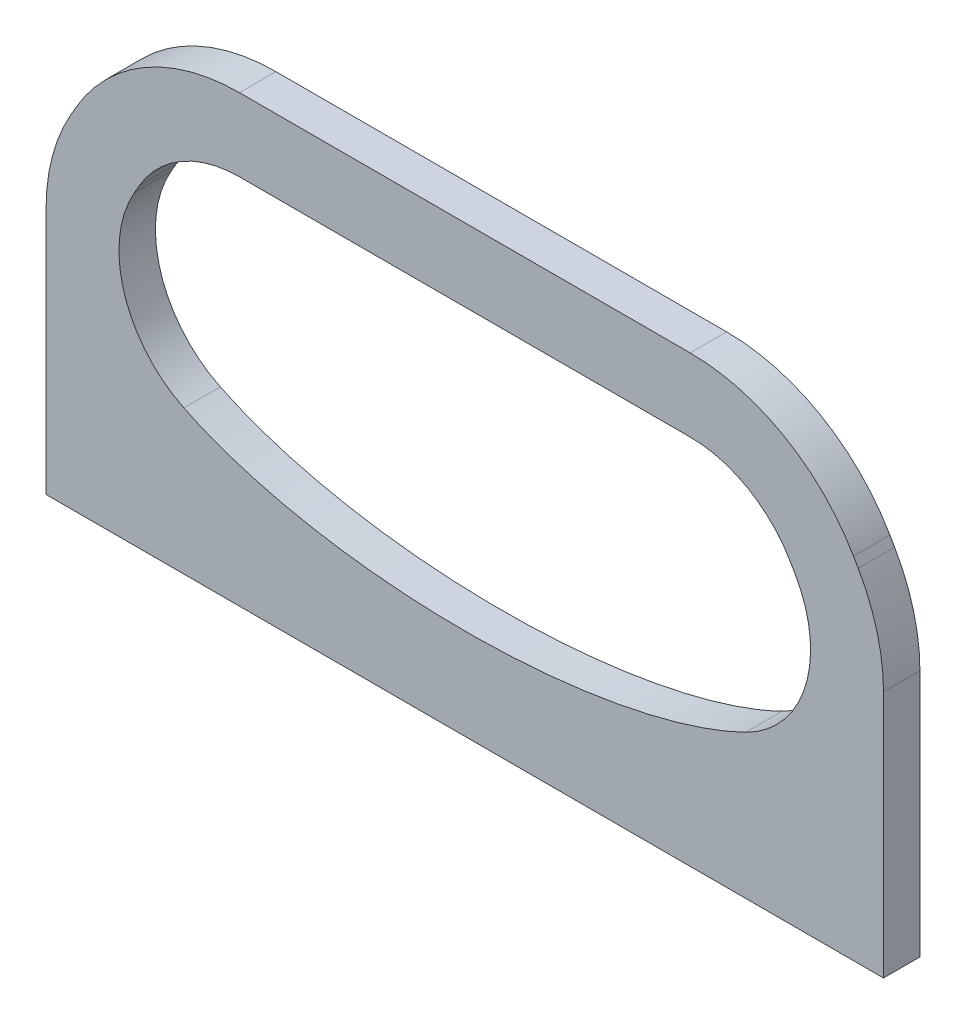
ISO-10303-21;
HEADER;
FILE_DESCRIPTION(('STEP AP214'),'2;1');
FILE_NAME('part.step','',(''),(''),'','','');
FILE_SCHEMA(('AUTOMOTIVE_DESIGN { 1 0 10303 214 1 1 1 1 }'));
ENDSEC;
DATA;
#1=APPLICATION_CONTEXT('core data for automotive mechanical design processes');
#2=APPLICATION_PROTOCOL_DEFINITION('international standard','automotive_design',2000,#1);
#3=PRODUCT_CONTEXT('',#1,'mechanical');
#4=PRODUCT('Part','Part','',(#3));
#5=PRODUCT_RELATED_PRODUCT_CATEGORY('part','',(#4));
#6=PRODUCT_DEFINITION_FORMATION('','',#4);
#7=PRODUCT_DEFINITION_CONTEXT('part definition',#1,'design');
#8=PRODUCT_DEFINITION('design','',#6,#7);
#9=PRODUCT_DEFINITION_SHAPE('','',#8);
#10=(LENGTH_UNIT() NAMED_UNIT(*) SI_UNIT(.MILLI.,.METRE.));
#11=(NAMED_UNIT(*) PLANE_ANGLE_UNIT() SI_UNIT($,.RADIAN.));
#12=(NAMED_UNIT(*) SI_UNIT($,.STERADIAN.) SOLID_ANGLE_UNIT());
#13=UNCERTAINTY_MEASURE_WITH_UNIT(LENGTH_MEASURE(1.E-05),#10,'distance_accuracy_value','');
#14=(GEOMETRIC_REPRESENTATION_CONTEXT(3) GLOBAL_UNCERTAINTY_ASSIGNED_CONTEXT((#13)) GLOBAL_UNIT_ASSIGNED_CONTEXT((#10,
#11,#12)) REPRESENTATION_CONTEXT('',''));
#15=CARTESIAN_POINT('',(0.,0.,0.));
#16=DIRECTION('',(0.,0.,1.));
#17=DIRECTION('',(1.,0.,0.));
#18=AXIS2_PLACEMENT_3D('',#15,#16,#17);
#19=CARTESIAN_POINT('',(0.,11.7,0.));
#20=DIRECTION('',(0.,1.,0.));
#21=DIRECTION('',(0.,0.,1.));
#22=AXIS2_PLACEMENT_3D('',#19,#20,#21);
#23=PLANE('',#22);
#24=DIRECTION('',(1.,0.,0.));
#25=VECTOR('',#24,1.);
#26=CARTESIAN_POINT('',(0.,11.7,-22.98));
#27=LINE('',#26,#25);
#28=CARTESIAN_POINT('',(-23.3818920339161,11.7,-22.98));
#29=VERTEX_POINT('',#28);
#30=CARTESIAN_POINT('',(-11.0181079660839,11.7,-22.98));
#31=VERTEX_POINT('',#30);
#32=EDGE_CURVE('E313',#29,#31,#27,.T.);
#33=ORIENTED_EDGE('',*,*,#32,.F.);
#34=DIRECTION('',(0.,0.,-1.));
#35=VECTOR('',#34,1.);
#36=CARTESIAN_POINT('',(-23.3818920339161,11.7,-21.98));
#37=LINE('',#36,#35);
#38=CARTESIAN_POINT('',(-23.3818920339161,11.7,-21.98));
#39=VERTEX_POINT('',#38);
#40=EDGE_CURVE('E209',#39,#29,#37,.T.);
#41=ORIENTED_EDGE('',*,*,#40,.F.);
#42=DIRECTION('',(-1.,0.,0.));
#43=VECTOR('',#42,1.);
#44=CARTESIAN_POINT('',(0.,11.7,-21.98));
#45=LINE('',#44,#43);
#46=CARTESIAN_POINT('',(-11.0181079660839,11.7,-21.98));
#47=VERTEX_POINT('',#46);
#48=EDGE_CURVE('E342',#47,#39,#45,.T.);
#49=ORIENTED_EDGE('',*,*,#48,.F.);
#50=DIRECTION('',(0.,0.,-1.));
#51=VECTOR('',#50,1.);
#52=CARTESIAN_POINT('',(-11.0181079660839,11.7,-21.98));
#53=LINE('',#52,#51);
#54=EDGE_CURVE('E206',#47,#31,#53,.T.);
#55=ORIENTED_EDGE('',*,*,#54,.T.);
#56=EDGE_LOOP('',(#33,#41,#49,#55));
#57=FACE_BOUND('',#56,.T.);
#58=ADVANCED_FACE('F58',(#57),#23,.T.);
#59=CARTESIAN_POINT('',(-17.2,5.85,-13.5));
#60=DIRECTION('',(0.,0.,1.));
#61=DIRECTION('',(1.,0.,0.));
#62=AXIS2_PLACEMENT_3D('',#59,#60,#61);
#63=ELLIPSE('',#62,9.8625,3.85);
#64=DIRECTION('',(0.,0.,-1.));
#65=VECTOR('',#64,1.);
#66=SURFACE_OF_LINEAR_EXTRUSION('',#63,#65);
#67=CARTESIAN_POINT('',(-17.2,5.85,-22.98));
#68=DIRECTION('',(0.,0.,1.));
#69=DIRECTION('',(1.,0.,0.));
#70=AXIS2_PLACEMENT_3D('',#67,#68,#69);
#71=ELLIPSE('',#70,9.8625,3.85);
#72=CARTESIAN_POINT('',(-24.9060416712449,3.44723053060076,-22.98));
#73=VERTEX_POINT('',#72);
#74=CARTESIAN_POINT('',(-9.49395832875332,3.44723053060165,-22.98));
#75=VERTEX_POINT('',#74);
#76=EDGE_CURVE('E331',#73,#75,#71,.T.);
#77=ORIENTED_EDGE('',*,*,#76,.F.);
#78=DIRECTION('',(0.,0.,-1.));
#79=VECTOR('',#78,1.);
#80=CARTESIAN_POINT('',(-24.9060416712437,3.4472305306002,-27.3373437472684));
#81=LINE('',#80,#79);
#82=CARTESIAN_POINT('',(-24.9060416712458,3.4472305306012,-21.98));
#83=VERTEX_POINT('',#82);
#84=EDGE_CURVE('E85',#73,#83,#81,.F.);
#85=ORIENTED_EDGE('',*,*,#84,.T.);
#86=CARTESIAN_POINT('',(-17.2,5.85,-21.98));
#87=DIRECTION('',(0.,0.,-1.));
#88=DIRECTION('',(1.,0.,0.));
#89=AXIS2_PLACEMENT_3D('',#86,#87,#88);
#90=ELLIPSE('',#89,9.8625,3.85);
#91=CARTESIAN_POINT('',(-9.49395832875422,3.44723053060121,-21.98));
#92=VERTEX_POINT('',#91);
#93=EDGE_CURVE('E182',#92,#83,#90,.T.);
#94=ORIENTED_EDGE('',*,*,#93,.F.);
#95=DIRECTION('',(0.,0.,-1.));
#96=VECTOR('',#95,1.);
#97=CARTESIAN_POINT('',(-9.49395832875629,3.4472305306002,-17.6626562527314));
#98=LINE('',#97,#96);
#99=EDGE_CURVE('E181',#92,#75,#98,.T.);
#100=ORIENTED_EDGE('',*,*,#99,.T.);
#101=EDGE_LOOP('',(#77,#85,#94,#100));
#102=FACE_BOUND('',#101,.T.);
#103=ADVANCED_FACE('F60',(#102),#66,.T.);
#104=CARTESIAN_POINT('',(-23.8875,9.7,-13.5));
#105=DIRECTION('',(0.,-1.,0.));
#106=DIRECTION('',(0.,0.,-1.));
#107=AXIS2_PLACEMENT_3D('',#104,#105,#106);
#108=PLANE('',#107);
#109=DIRECTION('',(-1.,0.,0.));
#110=VECTOR('',#109,1.);
#111=CARTESIAN_POINT('',(-23.8875,9.7,-22.98));
#112=LINE('',#111,#110);
#113=CARTESIAN_POINT('',(-11.0181079660839,9.7,-22.98));
#114=VERTEX_POINT('',#113);
#115=CARTESIAN_POINT('',(-23.3818920339161,9.7,-22.98));
#116=VERTEX_POINT('',#115);
#117=EDGE_CURVE('E315',#114,#116,#112,.T.);
#118=ORIENTED_EDGE('',*,*,#117,.F.);
#119=DIRECTION('',(0.,0.,-1.));
#120=VECTOR('',#119,1.);
#121=CARTESIAN_POINT('',(-11.0181079660839,9.7,-13.5));
#122=LINE('',#121,#120);
#123=CARTESIAN_POINT('',(-11.0181079660839,9.7,-21.98));
#124=VERTEX_POINT('',#123);
#125=EDGE_CURVE('E167',#114,#124,#122,.F.);
#126=ORIENTED_EDGE('',*,*,#125,.T.);
#127=DIRECTION('',(1.,0.,0.));
#128=VECTOR('',#127,1.);
#129=CARTESIAN_POINT('',(0.,9.7,-21.98));
#130=LINE('',#129,#128);
#131=CARTESIAN_POINT('',(-23.3818920339161,9.7,-21.98));
#132=VERTEX_POINT('',#131);
#133=EDGE_CURVE('E302',#132,#124,#130,.T.);
#134=ORIENTED_EDGE('',*,*,#133,.F.);
#135=DIRECTION('',(0.,0.,1.));
#136=VECTOR('',#135,1.);
#137=CARTESIAN_POINT('',(-23.3818920339161,9.7,-13.5));
#138=LINE('',#137,#136);
#139=EDGE_CURVE('E234',#132,#116,#138,.F.);
#140=ORIENTED_EDGE('',*,*,#139,.T.);
#141=EDGE_LOOP('',(#118,#126,#134,#140));
#142=FACE_BOUND('',#141,.T.);
#143=ADVANCED_FACE('F353',(#142),#108,.T.);
#144=CARTESIAN_POINT('',(-7.3375,6.5,-13.5));
#145=DIRECTION('',(-0.866025403784437,-0.500000000000003,0.));
#146=DIRECTION('',(0.,0.,1.));
#147=AXIS2_PLACEMENT_3D('',#144,#145,#146);
#148=PLANE('',#147);
#149=DIRECTION('',(0.,0.,1.));
#150=VECTOR('',#149,1.);
#151=CARTESIAN_POINT('',(-8.26847730906828,8.11250000000001,-13.5));
#152=LINE('',#151,#150);
#153=CARTESIAN_POINT('',(-8.26847730906891,8.1125000000011,-21.98));
#154=VERTEX_POINT('',#153);
#155=CARTESIAN_POINT('',(-8.26847730906828,8.11250000000001,-22.98));
#156=VERTEX_POINT('',#155);
#157=EDGE_CURVE('E166',#154,#156,#152,.F.);
#158=ORIENTED_EDGE('',*,*,#157,.T.);
#159=DIRECTION('',(-0.500000000000003,0.866025403784437,0.));
#160=VECTOR('',#159,1.);
#161=CARTESIAN_POINT('',(-7.3375,6.5,-22.98));
#162=LINE('',#161,#160);
#163=CARTESIAN_POINT('',(-8.13844800231135,7.88728263422404,-22.98));
#164=VERTEX_POINT('',#163);
#165=EDGE_CURVE('E76',#156,#164,#162,.F.);
#166=ORIENTED_EDGE('',*,*,#165,.T.);
#167=DIRECTION('',(0.,0.,1.));
#168=VECTOR('',#167,1.);
#169=CARTESIAN_POINT('',(-8.13844800231141,7.88728263422415,-13.5));
#170=LINE('',#169,#168);
#171=CARTESIAN_POINT('',(-8.13844800231134,7.88728263422404,-21.98));
#172=VERTEX_POINT('',#171);
#173=EDGE_CURVE('E157',#164,#172,#170,.T.);
#174=ORIENTED_EDGE('',*,*,#173,.T.);
#175=DIRECTION('',(0.500000000000003,-0.866025403784437,0.));
#176=VECTOR('',#175,1.);
#177=CARTESIAN_POINT('',(-2.68854243770054,-1.55223070013415,-21.98));
#178=LINE('',#177,#176);
#179=EDGE_CURVE('E161',#154,#172,#178,.T.);
#180=ORIENTED_EDGE('',*,*,#179,.F.);
#181=EDGE_LOOP('',(#158,#166,#174,#180));
#182=FACE_BOUND('',#181,.T.);
#183=ADVANCED_FACE('F160',(#182),#148,.T.);
#184=CARTESIAN_POINT('',(-25.2149791385932,9.7,-13.5));
#185=DIRECTION('',(0.866025403784437,-0.500000000000003,0.));
#186=DIRECTION('',(0.,0.,1.));
#187=AXIS2_PLACEMENT_3D('',#184,#185,#186);
#188=PLANE('',#187);
#189=DIRECTION('',(0.,0.,1.));
#190=VECTOR('',#189,1.);
#191=CARTESIAN_POINT('',(-26.2615519976886,7.88728263422415,-13.5));
#192=LINE('',#191,#190);
#193=CARTESIAN_POINT('',(-26.2615519976886,7.88728263422404,-21.98));
#194=VERTEX_POINT('',#193);
#195=CARTESIAN_POINT('',(-26.2615519976886,7.88728263422404,-22.98));
#196=VERTEX_POINT('',#195);
#197=EDGE_CURVE('E68',#194,#196,#192,.F.);
#198=ORIENTED_EDGE('',*,*,#197,.T.);
#199=DIRECTION('',(-0.500000000000003,-0.866025403784437,0.));
#200=VECTOR('',#199,1.);
#201=CARTESIAN_POINT('',(-25.2149791385932,9.7,-22.98));
#202=LINE('',#201,#200);
#203=CARTESIAN_POINT('',(-26.1315226909317,8.11250000000001,-22.98));
#204=VERTEX_POINT('',#203);
#205=EDGE_CURVE('E328',#196,#204,#202,.F.);
#206=ORIENTED_EDGE('',*,*,#205,.T.);
#207=DIRECTION('',(0.,0.,-1.));
#208=VECTOR('',#207,1.);
#209=CARTESIAN_POINT('',(-26.1315226909317,8.11250000000001,-13.5));
#210=LINE('',#209,#208);
#211=CARTESIAN_POINT('',(-26.1315226909317,8.11250000000001,-21.98));
#212=VERTEX_POINT('',#211);
#213=EDGE_CURVE('E239',#204,#212,#210,.F.);
#214=ORIENTED_EDGE('',*,*,#213,.T.);
#215=DIRECTION('',(0.500000000000003,0.866025403784437,0.));
#216=VECTOR('',#215,1.);
#217=CARTESIAN_POINT('',(-23.1114575622994,13.3434062449582,-21.98));
#218=LINE('',#217,#216);
#219=EDGE_CURVE('E296',#194,#212,#218,.T.);
#220=ORIENTED_EDGE('',*,*,#219,.F.);
#221=EDGE_LOOP('',(#198,#206,#214,#220));
#222=FACE_BOUND('',#221,.T.);
#223=ADVANCED_FACE('F366',(#222),#188,.T.);
#224=CARTESIAN_POINT('',(-10.888078659327,6.29978263422415,-22.5000000000001));
#225=DIRECTION('',(0.,0.,-1.));
#226=DIRECTION('',(-1.,0.,0.));
#227=AXIS2_PLACEMENT_3D('',#224,#225,#226);
#228=CYLINDRICAL_SURFACE('',#227,3.175);
#229=ORIENTED_EDGE('',*,*,#173,.F.);
#230=CARTESIAN_POINT('',(-10.888078659327,6.29978263422415,-22.98));
#231=DIRECTION('',(0.,0.,1.));
#232=DIRECTION('',(1.,0.,0.));
#233=AXIS2_PLACEMENT_3D('',#230,#231,#232);
#234=CIRCLE('',#233,3.175);
#235=EDGE_CURVE('E326',#164,#75,#234,.F.);
#236=ORIENTED_EDGE('',*,*,#235,.T.);
#237=ORIENTED_EDGE('',*,*,#99,.F.);
#238=CARTESIAN_POINT('',(-10.888078659327,6.29978263422415,-21.98));
#239=DIRECTION('',(0.,0.,1.));
#240=DIRECTION('',(1.,0.,0.));
#241=AXIS2_PLACEMENT_3D('',#238,#239,#240);
#242=CIRCLE('',#241,3.175);
#243=EDGE_CURVE('E174',#172,#92,#242,.F.);
#244=ORIENTED_EDGE('',*,*,#243,.F.);
#245=EDGE_LOOP('',(#229,#236,#237,#244));
#246=FACE_BOUND('',#245,.T.);
#247=ADVANCED_FACE('F179',(#246),#228,.F.);
#248=CARTESIAN_POINT('',(-23.511921340673,6.29978263422414,-22.5));
#249=DIRECTION('',(0.,0.,-1.));
#250=DIRECTION('',(-1.,0.,0.));
#251=AXIS2_PLACEMENT_3D('',#248,#249,#250);
#252=CYLINDRICAL_SURFACE('',#251,3.175);
#253=ORIENTED_EDGE('',*,*,#84,.F.);
#254=CARTESIAN_POINT('',(-23.511921340673,6.29978263422414,-22.98));
#255=DIRECTION('',(0.,0.,1.));
#256=DIRECTION('',(1.,0.,0.));
#257=AXIS2_PLACEMENT_3D('',#254,#255,#256);
#258=CIRCLE('',#257,3.175);
#259=EDGE_CURVE('E192',#73,#196,#258,.F.);
#260=ORIENTED_EDGE('',*,*,#259,.T.);
#261=ORIENTED_EDGE('',*,*,#197,.F.);
#262=CARTESIAN_POINT('',(-23.511921340673,6.29978263422414,-21.98));
#263=DIRECTION('',(0.,0.,1.));
#264=DIRECTION('',(1.,0.,0.));
#265=AXIS2_PLACEMENT_3D('',#262,#263,#264);
#266=CIRCLE('',#265,3.175);
#267=EDGE_CURVE('E294',#83,#194,#266,.F.);
#268=ORIENTED_EDGE('',*,*,#267,.F.);
#269=EDGE_LOOP('',(#253,#260,#261,#268));
#270=FACE_BOUND('',#269,.T.);
#271=ADVANCED_FACE('F361',(#270),#252,.F.);
#272=CARTESIAN_POINT('',(-23.3818920339161,6.525,-13.5));
#273=DIRECTION('',(0.,0.,1.));
#274=DIRECTION('',(1.,0.,0.));
#275=AXIS2_PLACEMENT_3D('',#272,#273,#274);
#276=CYLINDRICAL_SURFACE('',#275,3.175);
#277=ORIENTED_EDGE('',*,*,#213,.F.);
#278=CARTESIAN_POINT('',(-23.3818920339161,6.525,-22.98));
#279=DIRECTION('',(0.,0.,1.));
#280=DIRECTION('',(1.,0.,0.));
#281=AXIS2_PLACEMENT_3D('',#278,#279,#280);
#282=CIRCLE('',#281,3.175);
#283=EDGE_CURVE('E323',#204,#116,#282,.F.);
#284=ORIENTED_EDGE('',*,*,#283,.T.);
#285=ORIENTED_EDGE('',*,*,#139,.F.);
#286=CARTESIAN_POINT('',(-23.3818920339161,6.525,-21.98));
#287=DIRECTION('',(0.,0.,1.));
#288=DIRECTION('',(1.,0.,0.));
#289=AXIS2_PLACEMENT_3D('',#286,#287,#288);
#290=CIRCLE('',#289,3.175);
#291=EDGE_CURVE('E299',#212,#132,#290,.F.);
#292=ORIENTED_EDGE('',*,*,#291,.F.);
#293=EDGE_LOOP('',(#277,#284,#285,#292));
#294=FACE_BOUND('',#293,.T.);
#295=ADVANCED_FACE('F358',(#294),#276,.F.);
#296=CARTESIAN_POINT('',(-11.0181079660839,6.525,-13.5));
#297=DIRECTION('',(0.,0.,-1.));
#298=DIRECTION('',(-1.,0.,0.));
#299=AXIS2_PLACEMENT_3D('',#296,#297,#298);
#300=CYLINDRICAL_SURFACE('',#299,3.175);
#301=ORIENTED_EDGE('',*,*,#125,.F.);
#302=CARTESIAN_POINT('',(-11.0181079660839,6.525,-22.98));
#303=DIRECTION('',(0.,0.,1.));
#304=DIRECTION('',(1.,0.,0.));
#305=AXIS2_PLACEMENT_3D('',#302,#303,#304);
#306=CIRCLE('',#305,3.175);
#307=EDGE_CURVE('E310',#114,#156,#306,.F.);
#308=ORIENTED_EDGE('',*,*,#307,.T.);
#309=ORIENTED_EDGE('',*,*,#157,.F.);
#310=CARTESIAN_POINT('',(-11.0181079660839,6.525,-21.98));
#311=DIRECTION('',(0.,0.,1.));
#312=DIRECTION('',(1.,0.,0.));
#313=AXIS2_PLACEMENT_3D('',#310,#311,#312);
#314=CIRCLE('',#313,3.175);
#315=EDGE_CURVE('E177',#124,#154,#314,.F.);
#316=ORIENTED_EDGE('',*,*,#315,.F.);
#317=EDGE_LOOP('',(#301,#308,#309,#316));
#318=FACE_BOUND('',#317,.T.);
#319=ADVANCED_FACE('F308',(#318),#300,.F.);
#320=CARTESIAN_POINT('',(-5.713078659327,0.,-21.98));
#321=DIRECTION('',(-1.,0.,0.));
#322=DIRECTION('',(0.,0.,1.));
#323=AXIS2_PLACEMENT_3D('',#320,#321,#322);
#324=PLANE('',#323);
#325=DIRECTION('',(0.,0.,-1.));
#326=VECTOR('',#325,1.);
#327=CARTESIAN_POINT('',(-5.713078659327,-0.499999999999997,-21.98));
#328=LINE('',#327,#326);
#329=CARTESIAN_POINT('',(-5.713078659327,-0.499999999999997,-21.98));
#330=VERTEX_POINT('',#329);
#331=CARTESIAN_POINT('',(-5.713078659327,-0.499999999999997,-22.98));
#332=VERTEX_POINT('',#331);
#333=EDGE_CURVE('E184',#330,#332,#328,.T.);
#334=ORIENTED_EDGE('',*,*,#333,.T.);
#335=DIRECTION('',(0.,1.,0.));
#336=VECTOR('',#335,1.);
#337=CARTESIAN_POINT('',(-5.713078659327,0.,-22.98));
#338=LINE('',#337,#336);
#339=CARTESIAN_POINT('',(-5.713078659327,6.29978263422415,-22.98));
#340=VERTEX_POINT('',#339);
#341=EDGE_CURVE('E12',#332,#340,#338,.T.);
#342=ORIENTED_EDGE('',*,*,#341,.T.);
#343=DIRECTION('',(0.,0.,-1.));
#344=VECTOR('',#343,1.);
#345=CARTESIAN_POINT('',(-5.713078659327,6.29978263422415,-21.98));
#346=LINE('',#345,#344);
#347=CARTESIAN_POINT('',(-5.713078659327,6.29978263422415,-21.98));
#348=VERTEX_POINT('',#347);
#349=EDGE_CURVE('E235',#348,#340,#346,.T.);
#350=ORIENTED_EDGE('',*,*,#349,.F.);
#351=DIRECTION('',(0.,1.,0.));
#352=VECTOR('',#351,1.);
#353=CARTESIAN_POINT('',(-5.713078659327,0.,-21.98));
#354=LINE('',#353,#352);
#355=EDGE_CURVE('E260',#330,#348,#354,.T.);
#356=ORIENTED_EDGE('',*,*,#355,.F.);
#357=EDGE_LOOP('',(#334,#342,#350,#356));
#358=FACE_BOUND('',#357,.T.);
#359=ADVANCED_FACE('F356',(#358),#324,.F.);
#360=CARTESIAN_POINT('',(-10.888078659327,6.29978263422415,-21.98));
#361=DIRECTION('',(0.,0.,-1.));
#362=DIRECTION('',(-1.,0.,0.));
#363=AXIS2_PLACEMENT_3D('',#360,#361,#362);
#364=CYLINDRICAL_SURFACE('',#363,5.175);
#365=CARTESIAN_POINT('',(-10.888078659327,6.29978263422415,-22.98));
#366=DIRECTION('',(0.,0.,1.));
#367=DIRECTION('',(1.,0.,0.));
#368=AXIS2_PLACEMENT_3D('',#365,#366,#367);
#369=CIRCLE('',#368,5.175);
#370=CARTESIAN_POINT('',(-6.40639719474243,8.88728263422398,-22.98));
#371=VERTEX_POINT('',#370);
#372=EDGE_CURVE('E188',#340,#371,#369,.T.);
#373=ORIENTED_EDGE('',*,*,#372,.T.);
#374=DIRECTION('',(0.,0.,-1.));
#375=VECTOR('',#374,1.);
#376=CARTESIAN_POINT('',(-6.40639719474243,8.88728263422398,-21.98));
#377=LINE('',#376,#375);
#378=CARTESIAN_POINT('',(-6.40639719474243,8.88728263422398,-21.98));
#379=VERTEX_POINT('',#378);
#380=EDGE_CURVE('E216',#379,#371,#377,.T.);
#381=ORIENTED_EDGE('',*,*,#380,.F.);
#382=CARTESIAN_POINT('',(-10.888078659327,6.29978263422415,-21.98));
#383=DIRECTION('',(0.,0.,1.));
#384=DIRECTION('',(1.,0.,0.));
#385=AXIS2_PLACEMENT_3D('',#382,#383,#384);
#386=CIRCLE('',#385,5.175);
#387=EDGE_CURVE('E109',#348,#379,#386,.T.);
#388=ORIENTED_EDGE('',*,*,#387,.F.);
#389=ORIENTED_EDGE('',*,*,#349,.T.);
#390=EDGE_LOOP('',(#373,#381,#388,#389));
#391=FACE_BOUND('',#390,.T.);
#392=ADVANCED_FACE('F413',(#391),#364,.T.);
#393=CARTESIAN_POINT('',(-0.956491630131688,-0.552230700134156,-21.98));
#394=DIRECTION('',(-0.866025403784438,-0.500000000000001,0.));
#395=DIRECTION('',(0.500000000000001,-0.866025403784438,0.));
#396=AXIS2_PLACEMENT_3D('',#393,#394,#395);
#397=PLANE('',#396);
#398=DIRECTION('',(-0.500000000000001,0.866025403784438,0.));
#399=VECTOR('',#398,1.);
#400=CARTESIAN_POINT('',(-0.956491630131688,-0.552230700134156,-22.98));
#401=LINE('',#400,#399);
#402=CARTESIAN_POINT('',(-6.53642650150003,9.1125000000011,-22.98));
#403=VERTEX_POINT('',#402);
#404=EDGE_CURVE('E191',#371,#403,#401,.T.);
#405=ORIENTED_EDGE('',*,*,#404,.T.);
#406=DIRECTION('',(0.,0.,-1.));
#407=VECTOR('',#406,1.);
#408=CARTESIAN_POINT('',(-6.53642650150003,9.1125000000011,-21.98));
#409=LINE('',#408,#407);
#410=CARTESIAN_POINT('',(-6.53642650150003,9.1125000000011,-21.98));
#411=VERTEX_POINT('',#410);
#412=EDGE_CURVE('E208',#411,#403,#409,.T.);
#413=ORIENTED_EDGE('',*,*,#412,.F.);
#414=DIRECTION('',(-0.500000000000001,0.866025403784438,0.));
#415=VECTOR('',#414,1.);
#416=CARTESIAN_POINT('',(-0.956491630131688,-0.552230700134156,-21.98));
#417=LINE('',#416,#415);
#418=EDGE_CURVE('E338',#379,#411,#417,.T.);
#419=ORIENTED_EDGE('',*,*,#418,.F.);
#420=ORIENTED_EDGE('',*,*,#380,.T.);
#421=EDGE_LOOP('',(#405,#413,#419,#420));
#422=FACE_BOUND('',#421,.T.);
#423=ADVANCED_FACE('F416',(#422),#397,.F.);
#424=CARTESIAN_POINT('',(-11.0181079660839,6.525,-21.98));
#425=DIRECTION('',(0.,0.,-1.));
#426=DIRECTION('',(-1.,0.,0.));
#427=AXIS2_PLACEMENT_3D('',#424,#425,#426);
#428=CYLINDRICAL_SURFACE('',#427,5.175);
#429=CARTESIAN_POINT('',(-11.0181079660839,6.525,-22.98));
#430=DIRECTION('',(0.,0.,1.));
#431=DIRECTION('',(1.,0.,0.));
#432=AXIS2_PLACEMENT_3D('',#429,#430,#431);
#433=CIRCLE('',#432,5.175);
#434=EDGE_CURVE('E195',#403,#31,#433,.T.);
#435=ORIENTED_EDGE('',*,*,#434,.T.);
#436=ORIENTED_EDGE('',*,*,#54,.F.);
#437=CARTESIAN_POINT('',(-11.0181079660839,6.525,-21.98));
#438=DIRECTION('',(0.,0.,1.));
#439=DIRECTION('',(1.,0.,0.));
#440=AXIS2_PLACEMENT_3D('',#437,#438,#439);
#441=CIRCLE('',#440,5.175);
#442=EDGE_CURVE('E340',#411,#47,#441,.T.);
#443=ORIENTED_EDGE('',*,*,#442,.F.);
#444=ORIENTED_EDGE('',*,*,#412,.T.);
#445=EDGE_LOOP('',(#435,#436,#443,#444));
#446=FACE_BOUND('',#445,.T.);
#447=ADVANCED_FACE('F420',(#446),#428,.T.);
#448=CARTESIAN_POINT('',(-23.3818920339161,6.525,-21.98));
#449=DIRECTION('',(0.,0.,-1.));
#450=DIRECTION('',(-1.,0.,0.));
#451=AXIS2_PLACEMENT_3D('',#448,#449,#450);
#452=CYLINDRICAL_SURFACE('',#451,5.175);
#453=CARTESIAN_POINT('',(-23.3818920339161,6.525,-22.98));
#454=DIRECTION('',(0.,0.,1.));
#455=DIRECTION('',(1.,0.,0.));
#456=AXIS2_PLACEMENT_3D('',#453,#454,#455);
#457=CIRCLE('',#456,5.175);
#458=CARTESIAN_POINT('',(-27.8635734985006,9.11250000000001,-22.98));
#459=VERTEX_POINT('',#458);
#460=EDGE_CURVE('E203',#29,#459,#457,.T.);
#461=ORIENTED_EDGE('',*,*,#460,.T.);
#462=DIRECTION('',(0.,0.,-1.));
#463=VECTOR('',#462,1.);
#464=CARTESIAN_POINT('',(-27.8635734985006,9.11250000000001,-21.98));
#465=LINE('',#464,#463);
#466=CARTESIAN_POINT('',(-27.8635734985006,9.11250000000001,-21.98));
#467=VERTEX_POINT('',#466);
#468=EDGE_CURVE('E219',#467,#459,#465,.T.);
#469=ORIENTED_EDGE('',*,*,#468,.F.);
#470=CARTESIAN_POINT('',(-23.3818920339161,6.525,-21.98));
#471=DIRECTION('',(0.,0.,1.));
#472=DIRECTION('',(1.,0.,0.));
#473=AXIS2_PLACEMENT_3D('',#470,#471,#472);
#474=CIRCLE('',#473,5.175);
#475=EDGE_CURVE('E289',#39,#467,#474,.T.);
#476=ORIENTED_EDGE('',*,*,#475,.F.);
#477=ORIENTED_EDGE('',*,*,#40,.T.);
#478=EDGE_LOOP('',(#461,#469,#476,#477));
#479=FACE_BOUND('',#478,.T.);
#480=ADVANCED_FACE('F343',(#479),#452,.T.);
#481=CARTESIAN_POINT('',(-24.8435083698684,14.3434062449581,-21.98));
#482=DIRECTION('',(0.866025403784441,-0.499999999999996,0.));
#483=DIRECTION('',(0.499999999999996,0.866025403784441,0.));
#484=AXIS2_PLACEMENT_3D('',#481,#482,#483);
#485=PLANE('',#484);
#486=DIRECTION('',(-0.499999999999996,-0.866025403784441,0.));
#487=VECTOR('',#486,1.);
#488=CARTESIAN_POINT('',(-24.8435083698684,14.3434062449581,-22.98));
#489=LINE('',#488,#487);
#490=CARTESIAN_POINT('',(-27.9936028052576,8.88728263422397,-22.98));
#491=VERTEX_POINT('',#490);
#492=EDGE_CURVE('E198',#459,#491,#489,.T.);
#493=ORIENTED_EDGE('',*,*,#492,.T.);
#494=DIRECTION('',(0.,0.,-1.));
#495=VECTOR('',#494,1.);
#496=CARTESIAN_POINT('',(-27.9936028052576,8.88728263422397,-21.98));
#497=LINE('',#496,#495);
#498=CARTESIAN_POINT('',(-27.9936028052576,8.88728263422397,-21.98));
#499=VERTEX_POINT('',#498);
#500=EDGE_CURVE('E226',#499,#491,#497,.T.);
#501=ORIENTED_EDGE('',*,*,#500,.F.);
#502=DIRECTION('',(-0.499999999999996,-0.866025403784441,0.));
#503=VECTOR('',#502,1.);
#504=CARTESIAN_POINT('',(-24.8435083698684,14.3434062449581,-21.98));
#505=LINE('',#504,#503);
#506=EDGE_CURVE('E285',#467,#499,#505,.T.);
#507=ORIENTED_EDGE('',*,*,#506,.F.);
#508=ORIENTED_EDGE('',*,*,#468,.T.);
#509=EDGE_LOOP('',(#493,#501,#507,#508));
#510=FACE_BOUND('',#509,.T.);
#511=ADVANCED_FACE('F273',(#510),#485,.F.);
#512=CARTESIAN_POINT('',(-23.511921340673,6.29978263422414,-21.98));
#513=DIRECTION('',(0.,0.,-1.));
#514=DIRECTION('',(-1.,0.,0.));
#515=AXIS2_PLACEMENT_3D('',#512,#513,#514);
#516=CYLINDRICAL_SURFACE('',#515,5.175);
#517=CARTESIAN_POINT('',(-23.511921340673,6.29978263422414,-22.98));
#518=DIRECTION('',(0.,0.,1.));
#519=DIRECTION('',(1.,0.,0.));
#520=AXIS2_PLACEMENT_3D('',#517,#518,#519);
#521=CIRCLE('',#520,5.175);
#522=CARTESIAN_POINT('',(-28.686921340673,6.29978263422414,-22.98));
#523=VERTEX_POINT('',#522);
#524=EDGE_CURVE('E262',#491,#523,#521,.T.);
#525=ORIENTED_EDGE('',*,*,#524,.T.);
#526=DIRECTION('',(0.,0.,-1.));
#527=VECTOR('',#526,1.);
#528=CARTESIAN_POINT('',(-28.686921340673,6.29978263422414,-21.98));
#529=LINE('',#528,#527);
#530=CARTESIAN_POINT('',(-28.686921340673,6.29978263422414,-21.98));
#531=VERTEX_POINT('',#530);
#532=EDGE_CURVE('E250',#531,#523,#529,.T.);
#533=ORIENTED_EDGE('',*,*,#532,.F.);
#534=CARTESIAN_POINT('',(-23.511921340673,6.29978263422414,-21.98));
#535=DIRECTION('',(0.,0.,1.));
#536=DIRECTION('',(1.,0.,0.));
#537=AXIS2_PLACEMENT_3D('',#534,#535,#536);
#538=CIRCLE('',#537,5.175);
#539=EDGE_CURVE('E281',#499,#531,#538,.T.);
#540=ORIENTED_EDGE('',*,*,#539,.F.);
#541=ORIENTED_EDGE('',*,*,#500,.T.);
#542=EDGE_LOOP('',(#525,#533,#540,#541));
#543=FACE_BOUND('',#542,.T.);
#544=ADVANCED_FACE('F280',(#543),#516,.T.);
#545=CARTESIAN_POINT('',(-28.686921340673,0.,-21.98));
#546=DIRECTION('',(1.,0.,0.));
#547=DIRECTION('',(0.,0.,-1.));
#548=AXIS2_PLACEMENT_3D('',#545,#546,#547);
#549=PLANE('',#548);
#550=DIRECTION('',(0.,-1.,0.));
#551=VECTOR('',#550,1.);
#552=CARTESIAN_POINT('',(-28.686921340673,0.,-22.98));
#553=LINE('',#552,#551);
#554=CARTESIAN_POINT('',(-28.686921340673,-0.5,-22.98));
#555=VERTEX_POINT('',#554);
#556=EDGE_CURVE('E261',#523,#555,#553,.T.);
#557=ORIENTED_EDGE('',*,*,#556,.T.);
#558=DIRECTION('',(0.,0.,-1.));
#559=VECTOR('',#558,1.);
#560=CARTESIAN_POINT('',(-28.686921340673,-0.5,-21.98));
#561=LINE('',#560,#559);
#562=CARTESIAN_POINT('',(-28.686921340673,-0.5,-21.98));
#563=VERTEX_POINT('',#562);
#564=EDGE_CURVE('E253',#563,#555,#561,.T.);
#565=ORIENTED_EDGE('',*,*,#564,.F.);
#566=DIRECTION('',(0.,-1.,0.));
#567=VECTOR('',#566,1.);
#568=CARTESIAN_POINT('',(-28.686921340673,0.,-21.98));
#569=LINE('',#568,#567);
#570=EDGE_CURVE('E284',#531,#563,#569,.T.);
#571=ORIENTED_EDGE('',*,*,#570,.F.);
#572=ORIENTED_EDGE('',*,*,#532,.T.);
#573=EDGE_LOOP('',(#557,#565,#571,#572));
#574=FACE_BOUND('',#573,.T.);
#575=ADVANCED_FACE('F405',(#574),#549,.F.);
#576=CARTESIAN_POINT('',(0.,-0.499999999999997,-21.98));
#577=DIRECTION('',(0.,1.,0.));
#578=DIRECTION('',(-1.,0.,0.));
#579=AXIS2_PLACEMENT_3D('',#576,#577,#578);
#580=PLANE('',#579);
#581=DIRECTION('',(1.,0.,0.));
#582=VECTOR('',#581,1.);
#583=CARTESIAN_POINT('',(0.,-0.499999999999997,-22.98));
#584=LINE('',#583,#582);
#585=EDGE_CURVE('E258',#555,#332,#584,.T.);
#586=ORIENTED_EDGE('',*,*,#585,.T.);
#587=ORIENTED_EDGE('',*,*,#333,.F.);
#588=DIRECTION('',(1.,0.,0.));
#589=VECTOR('',#588,1.);
#590=CARTESIAN_POINT('',(0.,-0.499999999999997,-21.98));
#591=LINE('',#590,#589);
#592=EDGE_CURVE('E287',#563,#330,#591,.T.);
#593=ORIENTED_EDGE('',*,*,#592,.F.);
#594=ORIENTED_EDGE('',*,*,#564,.T.);
#595=EDGE_LOOP('',(#586,#587,#593,#594));
#596=FACE_BOUND('',#595,.T.);
#597=ADVANCED_FACE('F408',(#596),#580,.F.);
#598=CARTESIAN_POINT('',(0.,0.,-21.98));
#599=DIRECTION('',(0.,0.,1.));
#600=DIRECTION('',(1.,0.,0.));
#601=AXIS2_PLACEMENT_3D('',#598,#599,#600);
#602=PLANE('',#601);
#603=ORIENTED_EDGE('',*,*,#355,.T.);
#604=ORIENTED_EDGE('',*,*,#387,.T.);
#605=ORIENTED_EDGE('',*,*,#418,.T.);
#606=ORIENTED_EDGE('',*,*,#442,.T.);
#607=ORIENTED_EDGE('',*,*,#48,.T.);
#608=ORIENTED_EDGE('',*,*,#475,.T.);
#609=ORIENTED_EDGE('',*,*,#506,.T.);
#610=ORIENTED_EDGE('',*,*,#539,.T.);
#611=ORIENTED_EDGE('',*,*,#570,.T.);
#612=ORIENTED_EDGE('',*,*,#592,.T.);
#613=EDGE_LOOP('',(#603,#604,#605,#606,#607,#608,#609,#610,#611,#612));
#614=FACE_BOUND('',#613,.T.);
#615=ORIENTED_EDGE('',*,*,#267,.T.);
#616=ORIENTED_EDGE('',*,*,#219,.T.);
#617=ORIENTED_EDGE('',*,*,#291,.T.);
#618=ORIENTED_EDGE('',*,*,#133,.T.);
#619=ORIENTED_EDGE('',*,*,#315,.T.);
#620=ORIENTED_EDGE('',*,*,#179,.T.);
#621=ORIENTED_EDGE('',*,*,#243,.T.);
#622=ORIENTED_EDGE('',*,*,#93,.T.);
#623=EDGE_LOOP('',(#615,#616,#617,#618,#619,#620,#621,#622));
#624=FACE_BOUND('',#623,.T.);
#625=ADVANCED_FACE('F173',(#614,#624),#602,.T.);
#626=CARTESIAN_POINT('',(0.,0.,-22.98));
#627=DIRECTION('',(0.,0.,1.));
#628=DIRECTION('',(1.,0.,0.));
#629=AXIS2_PLACEMENT_3D('',#626,#627,#628);
#630=PLANE('',#629);
#631=ORIENTED_EDGE('',*,*,#585,.F.);
#632=ORIENTED_EDGE('',*,*,#556,.F.);
#633=ORIENTED_EDGE('',*,*,#524,.F.);
#634=ORIENTED_EDGE('',*,*,#492,.F.);
#635=ORIENTED_EDGE('',*,*,#460,.F.);
#636=ORIENTED_EDGE('',*,*,#32,.T.);
#637=ORIENTED_EDGE('',*,*,#434,.F.);
#638=ORIENTED_EDGE('',*,*,#404,.F.);
#639=ORIENTED_EDGE('',*,*,#372,.F.);
#640=ORIENTED_EDGE('',*,*,#341,.F.);
#641=EDGE_LOOP('',(#631,#632,#633,#634,#635,#636,#637,#638,#639,#640));
#642=FACE_BOUND('',#641,.T.);
#643=ORIENTED_EDGE('',*,*,#76,.T.);
#644=ORIENTED_EDGE('',*,*,#235,.F.);
#645=ORIENTED_EDGE('',*,*,#165,.F.);
#646=ORIENTED_EDGE('',*,*,#307,.F.);
#647=ORIENTED_EDGE('',*,*,#117,.T.);
#648=ORIENTED_EDGE('',*,*,#283,.F.);
#649=ORIENTED_EDGE('',*,*,#205,.F.);
#650=ORIENTED_EDGE('',*,*,#259,.F.);
#651=EDGE_LOOP('',(#643,#644,#645,#646,#647,#648,#649,#650));
#652=FACE_BOUND('',#651,.T.);
#653=ADVANCED_FACE('F345',(#642,#652),#630,.F.);
#654=CLOSED_SHELL('',(#58,#103,#143,#183,#223,#247,#271,#295,#319,#359,#392,#423,#447,#480,#511,
#544,#575,#597,#625,#653));
#655=MANIFOLD_SOLID_BREP('B2',#654);
#656=ADVANCED_BREP_SHAPE_REPRESENTATION('',(#18,#655),#14);
#657=SHAPE_DEFINITION_REPRESENTATION(#9,#656);
ENDSEC;
END-ISO-10303-21;
